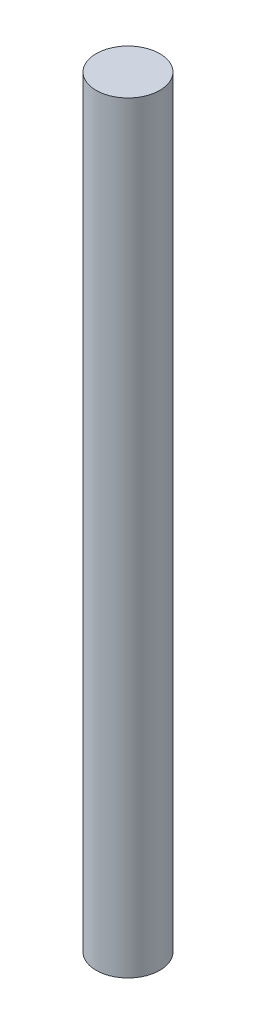
ISO-10303-21;
HEADER;
FILE_DESCRIPTION(('STEP AP214'),'2;1');
FILE_NAME('part.step','',(''),(''),'','','');
FILE_SCHEMA(('AUTOMOTIVE_DESIGN { 1 0 10303 214 1 1 1 1 }'));
ENDSEC;
DATA;
#1=APPLICATION_CONTEXT('core data for automotive mechanical design processes');
#2=APPLICATION_PROTOCOL_DEFINITION('international standard','automotive_design',2000,#1);
#3=PRODUCT_CONTEXT('',#1,'mechanical');
#4=PRODUCT('Part','Part','',(#3));
#5=PRODUCT_RELATED_PRODUCT_CATEGORY('part','',(#4));
#6=PRODUCT_DEFINITION_FORMATION('','',#4);
#7=PRODUCT_DEFINITION_CONTEXT('part definition',#1,'design');
#8=PRODUCT_DEFINITION('design','',#6,#7);
#9=PRODUCT_DEFINITION_SHAPE('','',#8);
#10=(LENGTH_UNIT() NAMED_UNIT(*) SI_UNIT(.MILLI.,.METRE.));
#11=(NAMED_UNIT(*) PLANE_ANGLE_UNIT() SI_UNIT($,.RADIAN.));
#12=(NAMED_UNIT(*) SI_UNIT($,.STERADIAN.) SOLID_ANGLE_UNIT());
#13=UNCERTAINTY_MEASURE_WITH_UNIT(LENGTH_MEASURE(1.E-05),#10,'distance_accuracy_value','');
#14=(GEOMETRIC_REPRESENTATION_CONTEXT(3) GLOBAL_UNCERTAINTY_ASSIGNED_CONTEXT((#13)) GLOBAL_UNIT_ASSIGNED_CONTEXT((#10,
#11,#12)) REPRESENTATION_CONTEXT('',''));
#15=CARTESIAN_POINT('',(0.,0.,0.));
#16=DIRECTION('',(0.,0.,1.));
#17=DIRECTION('',(1.,0.,0.));
#18=AXIS2_PLACEMENT_3D('',#15,#16,#17);
#19=CARTESIAN_POINT('',(0.,76.,0.));
#20=DIRECTION('',(0.,-1.,0.));
#21=DIRECTION('',(0.,0.,-1.));
#22=AXIS2_PLACEMENT_3D('',#19,#20,#21);
#23=CYLINDRICAL_SURFACE('',#22,3.175);
#24=CARTESIAN_POINT('',(0.,76.,0.));
#25=DIRECTION('',(0.,1.,0.));
#26=DIRECTION('',(0.,0.,1.));
#27=AXIS2_PLACEMENT_3D('',#24,#25,#26);
#28=CIRCLE('',#27,3.175);
#29=CARTESIAN_POINT('',(0.,76.,3.175));
#30=VERTEX_POINT('',#29);
#31=EDGE_CURVE('E10',#30,#30,#28,.T.);
#32=ORIENTED_EDGE('',*,*,#31,.F.);
#33=EDGE_LOOP('',(#32));
#34=FACE_BOUND('',#33,.T.);
#35=CARTESIAN_POINT('',(0.,0.,0.));
#36=DIRECTION('',(0.,1.,0.));
#37=DIRECTION('',(0.,0.,1.));
#38=AXIS2_PLACEMENT_3D('',#35,#36,#37);
#39=CIRCLE('',#38,3.175);
#40=CARTESIAN_POINT('',(0.,0.,3.175));
#41=VERTEX_POINT('',#40);
#42=EDGE_CURVE('E33',#41,#41,#39,.T.);
#43=ORIENTED_EDGE('',*,*,#42,.T.);
#44=EDGE_LOOP('',(#43));
#45=FACE_BOUND('',#44,.T.);
#46=ADVANCED_FACE('F30',(#34,#45),#23,.T.);
#47=CARTESIAN_POINT('',(0.,76.,0.));
#48=DIRECTION('',(0.,1.,0.));
#49=DIRECTION('',(0.,0.,1.));
#50=AXIS2_PLACEMENT_3D('',#47,#48,#49);
#51=PLANE('',#50);
#52=ORIENTED_EDGE('',*,*,#31,.T.);
#53=EDGE_LOOP('',(#52));
#54=FACE_BOUND('',#53,.T.);
#55=ADVANCED_FACE('F45',(#54),#51,.T.);
#56=CARTESIAN_POINT('',(0.,0.,0.));
#57=DIRECTION('',(0.,1.,0.));
#58=DIRECTION('',(0.,0.,1.));
#59=AXIS2_PLACEMENT_3D('',#56,#57,#58);
#60=PLANE('',#59);
#61=ORIENTED_EDGE('',*,*,#42,.F.);
#62=EDGE_LOOP('',(#61));
#63=FACE_BOUND('',#62,.T.);
#64=ADVANCED_FACE('F43',(#63),#60,.F.);
#65=CLOSED_SHELL('',(#46,#55,#64));
#66=MANIFOLD_SOLID_BREP('B2',#65);
#67=ADVANCED_BREP_SHAPE_REPRESENTATION('',(#18,#66),#14);
#68=SHAPE_DEFINITION_REPRESENTATION(#9,#67);
ENDSEC;
END-ISO-10303-21;
